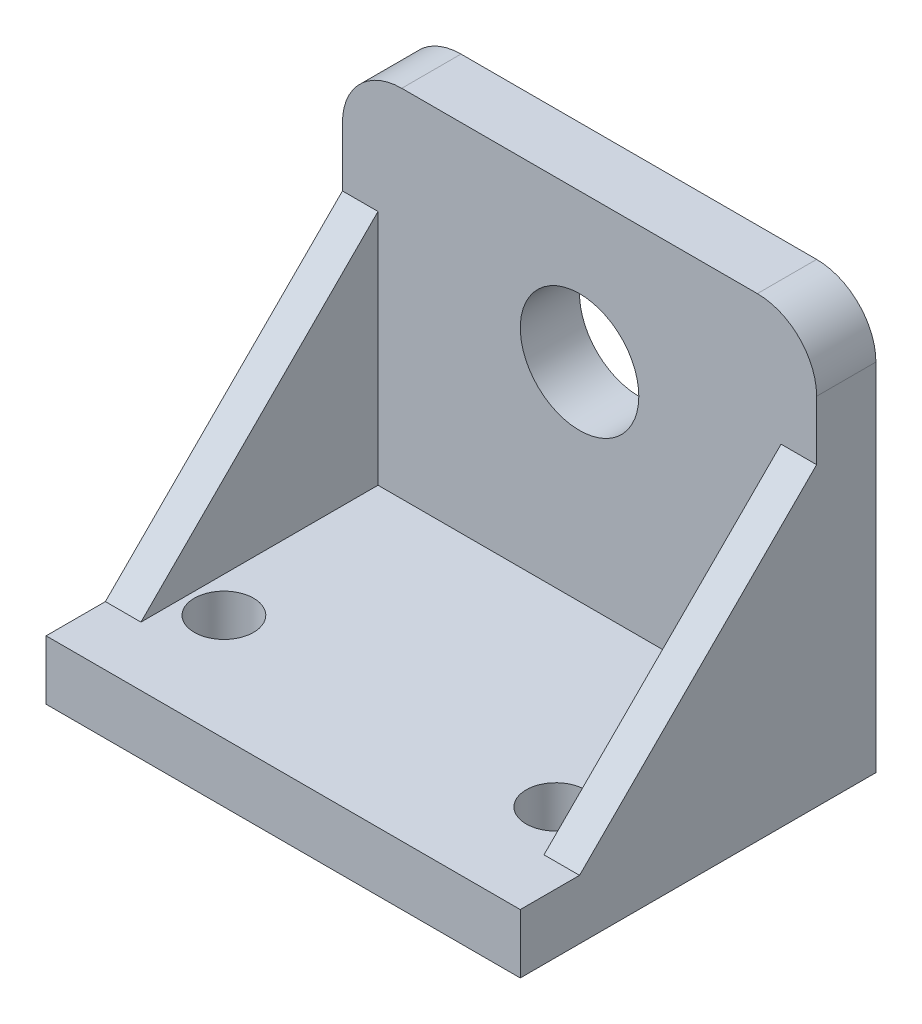
ISO-10303-21;
HEADER;
FILE_DESCRIPTION(('STEP AP214'),'2;1');
FILE_NAME('part.step','',(''),(''),'','','');
FILE_SCHEMA(('AUTOMOTIVE_DESIGN { 1 0 10303 214 1 1 1 1 }'));
ENDSEC;
DATA;
#1=APPLICATION_CONTEXT('core data for automotive mechanical design processes');
#2=APPLICATION_PROTOCOL_DEFINITION('international standard','automotive_design',2000,#1);
#3=PRODUCT_CONTEXT('',#1,'mechanical');
#4=PRODUCT('Part','Part','',(#3));
#5=PRODUCT_RELATED_PRODUCT_CATEGORY('part','',(#4));
#6=PRODUCT_DEFINITION_FORMATION('','',#4);
#7=PRODUCT_DEFINITION_CONTEXT('part definition',#1,'design');
#8=PRODUCT_DEFINITION('design','',#6,#7);
#9=PRODUCT_DEFINITION_SHAPE('','',#8);
#10=(LENGTH_UNIT() NAMED_UNIT(*) SI_UNIT(.MILLI.,.METRE.));
#11=(NAMED_UNIT(*) PLANE_ANGLE_UNIT() SI_UNIT($,.RADIAN.));
#12=(NAMED_UNIT(*) SI_UNIT($,.STERADIAN.) SOLID_ANGLE_UNIT());
#13=UNCERTAINTY_MEASURE_WITH_UNIT(LENGTH_MEASURE(1.E-05),#10,'distance_accuracy_value','');
#14=(GEOMETRIC_REPRESENTATION_CONTEXT(3) GLOBAL_UNCERTAINTY_ASSIGNED_CONTEXT((#13)) GLOBAL_UNIT_ASSIGNED_CONTEXT((#10,
#11,#12)) REPRESENTATION_CONTEXT('',''));
#15=CARTESIAN_POINT('',(0.,0.,0.));
#16=DIRECTION('',(0.,0.,1.));
#17=DIRECTION('',(1.,0.,0.));
#18=AXIS2_PLACEMENT_3D('',#15,#16,#17);
#19=CARTESIAN_POINT('',(0.,10.,0.));
#20=DIRECTION('',(0.,-1.,0.));
#21=DIRECTION('',(0.,0.,-1.));
#22=AXIS2_PLACEMENT_3D('',#19,#20,#21);
#23=PLANE('',#22);
#24=CARTESIAN_POINT('',(-28.,10.,42.));
#25=DIRECTION('',(0.,-1.,0.));
#26=DIRECTION('',(0.,0.,-1.));
#27=AXIS2_PLACEMENT_3D('',#24,#25,#26);
#28=CIRCLE('',#27,5.);
#29=CARTESIAN_POINT('',(-28.,10.,37.));
#30=VERTEX_POINT('',#29);
#31=EDGE_CURVE('E308',#30,#30,#28,.F.);
#32=ORIENTED_EDGE('',*,*,#31,.F.);
#33=EDGE_LOOP('',(#32));
#34=FACE_BOUND('',#33,.T.);
#35=CARTESIAN_POINT('',(28.,10.,42.));
#36=DIRECTION('',(0.,-1.,0.));
#37=DIRECTION('',(0.,0.,-1.));
#38=AXIS2_PLACEMENT_3D('',#35,#36,#37);
#39=CIRCLE('',#38,5.);
#40=CARTESIAN_POINT('',(28.,10.,37.));
#41=VERTEX_POINT('',#40);
#42=EDGE_CURVE('E312',#41,#41,#39,.F.);
#43=ORIENTED_EDGE('',*,*,#42,.F.);
#44=EDGE_LOOP('',(#43));
#45=FACE_BOUND('',#44,.T.);
#46=DIRECTION('',(-1.,0.,0.));
#47=VECTOR('',#46,1.);
#48=CARTESIAN_POINT('',(40.,10.,50.));
#49=LINE('',#48,#47);
#50=CARTESIAN_POINT('',(40.,10.,50.));
#51=VERTEX_POINT('',#50);
#52=CARTESIAN_POINT('',(34.,10.,50.));
#53=VERTEX_POINT('',#52);
#54=EDGE_CURVE('E68',#51,#53,#49,.T.);
#55=ORIENTED_EDGE('',*,*,#54,.T.);
#56=DIRECTION('',(0.,0.,-1.));
#57=VECTOR('',#56,1.);
#58=CARTESIAN_POINT('',(34.,10.,10.));
#59=LINE('',#58,#57);
#60=CARTESIAN_POINT('',(34.,10.,10.));
#61=VERTEX_POINT('',#60);
#62=EDGE_CURVE('E291',#53,#61,#59,.T.);
#63=ORIENTED_EDGE('',*,*,#62,.T.);
#64=DIRECTION('',(-1.,0.,0.));
#65=VECTOR('',#64,1.);
#66=CARTESIAN_POINT('',(0.,10.,10.));
#67=LINE('',#66,#65);
#68=CARTESIAN_POINT('',(-34.,10.,10.));
#69=VERTEX_POINT('',#68);
#70=EDGE_CURVE('E163',#61,#69,#67,.T.);
#71=ORIENTED_EDGE('',*,*,#70,.T.);
#72=DIRECTION('',(0.,0.,-1.));
#73=VECTOR('',#72,1.);
#74=CARTESIAN_POINT('',(-34.,10.,10.));
#75=LINE('',#74,#73);
#76=CARTESIAN_POINT('',(-34.,10.,50.));
#77=VERTEX_POINT('',#76);
#78=EDGE_CURVE('E278',#77,#69,#75,.T.);
#79=ORIENTED_EDGE('',*,*,#78,.F.);
#80=DIRECTION('',(-1.,0.,0.));
#81=VECTOR('',#80,1.);
#82=CARTESIAN_POINT('',(-34.,10.,50.));
#83=LINE('',#82,#81);
#84=CARTESIAN_POINT('',(-40.,10.,50.));
#85=VERTEX_POINT('',#84);
#86=EDGE_CURVE('E275',#77,#85,#83,.T.);
#87=ORIENTED_EDGE('',*,*,#86,.T.);
#88=DIRECTION('',(0.,0.,1.));
#89=VECTOR('',#88,1.);
#90=CARTESIAN_POINT('',(-40.,10.,60.));
#91=LINE('',#90,#89);
#92=CARTESIAN_POINT('',(-40.,10.,60.));
#93=VERTEX_POINT('',#92);
#94=EDGE_CURVE('E205',#85,#93,#91,.T.);
#95=ORIENTED_EDGE('',*,*,#94,.T.);
#96=DIRECTION('',(1.,0.,0.));
#97=VECTOR('',#96,1.);
#98=CARTESIAN_POINT('',(40.,10.,60.));
#99=LINE('',#98,#97);
#100=CARTESIAN_POINT('',(40.,10.,60.));
#101=VERTEX_POINT('',#100);
#102=EDGE_CURVE('E208',#93,#101,#99,.T.);
#103=ORIENTED_EDGE('',*,*,#102,.T.);
#104=DIRECTION('',(0.,0.,-1.));
#105=VECTOR('',#104,1.);
#106=CARTESIAN_POINT('',(40.,10.,0.));
#107=LINE('',#106,#105);
#108=EDGE_CURVE('E212',#101,#51,#107,.T.);
#109=ORIENTED_EDGE('',*,*,#108,.T.);
#110=EDGE_LOOP('',(#55,#63,#71,#79,#87,#95,#103,#109));
#111=FACE_BOUND('',#110,.T.);
#112=ADVANCED_FACE('F51',(#34,#45,#111),#23,.F.);
#113=CARTESIAN_POINT('',(30.,60.,10.));
#114=DIRECTION('',(0.,0.,1.));
#115=DIRECTION('',(1.,0.,0.));
#116=AXIS2_PLACEMENT_3D('',#113,#114,#115);
#117=PLANE('',#116);
#118=CARTESIAN_POINT('',(0.,45.,10.));
#119=DIRECTION('',(0.,0.,1.));
#120=DIRECTION('',(1.,0.,0.));
#121=AXIS2_PLACEMENT_3D('',#118,#119,#120);
#122=CIRCLE('',#121,10.);
#123=CARTESIAN_POINT('',(10.,45.,10.));
#124=VERTEX_POINT('',#123);
#125=EDGE_CURVE('E299',#124,#124,#122,.F.);
#126=ORIENTED_EDGE('',*,*,#125,.T.);
#127=EDGE_LOOP('',(#126));
#128=FACE_BOUND('',#127,.T.);
#129=DIRECTION('',(0.,1.,0.));
#130=VECTOR('',#129,1.);
#131=CARTESIAN_POINT('',(34.,50.,10.));
#132=LINE('',#131,#130);
#133=CARTESIAN_POINT('',(34.,50.,10.));
#134=VERTEX_POINT('',#133);
#135=EDGE_CURVE('E76',#61,#134,#132,.T.);
#136=ORIENTED_EDGE('',*,*,#135,.T.);
#137=DIRECTION('',(-1.,0.,0.));
#138=VECTOR('',#137,1.);
#139=CARTESIAN_POINT('',(40.,50.,10.));
#140=LINE('',#139,#138);
#141=CARTESIAN_POINT('',(40.,50.,10.));
#142=VERTEX_POINT('',#141);
#143=EDGE_CURVE('E148',#142,#134,#140,.T.);
#144=ORIENTED_EDGE('',*,*,#143,.F.);
#145=DIRECTION('',(0.,1.,0.));
#146=VECTOR('',#145,1.);
#147=CARTESIAN_POINT('',(40.,0.,10.));
#148=LINE('',#147,#146);
#149=CARTESIAN_POINT('',(40.,60.,10.));
#150=VERTEX_POINT('',#149);
#151=EDGE_CURVE('E141',#142,#150,#148,.T.);
#152=ORIENTED_EDGE('',*,*,#151,.T.);
#153=CARTESIAN_POINT('',(30.,60.,10.));
#154=DIRECTION('',(0.,0.,1.));
#155=DIRECTION('',(1.,0.,0.));
#156=AXIS2_PLACEMENT_3D('',#153,#154,#155);
#157=CIRCLE('',#156,10.);
#158=CARTESIAN_POINT('',(30.,70.,10.));
#159=VERTEX_POINT('',#158);
#160=EDGE_CURVE('E145',#150,#159,#157,.T.);
#161=ORIENTED_EDGE('',*,*,#160,.T.);
#162=DIRECTION('',(-1.,0.,0.));
#163=VECTOR('',#162,1.);
#164=CARTESIAN_POINT('',(30.,70.,10.));
#165=LINE('',#164,#163);
#166=CARTESIAN_POINT('',(-30.,70.,10.));
#167=VERTEX_POINT('',#166);
#168=EDGE_CURVE('E170',#159,#167,#165,.T.);
#169=ORIENTED_EDGE('',*,*,#168,.T.);
#170=CARTESIAN_POINT('',(-30.,60.,10.));
#171=DIRECTION('',(0.,0.,1.));
#172=DIRECTION('',(1.,0.,0.));
#173=AXIS2_PLACEMENT_3D('',#170,#171,#172);
#174=CIRCLE('',#173,10.);
#175=CARTESIAN_POINT('',(-40.,60.,10.));
#176=VERTEX_POINT('',#175);
#177=EDGE_CURVE('E175',#167,#176,#174,.T.);
#178=ORIENTED_EDGE('',*,*,#177,.T.);
#179=DIRECTION('',(0.,-1.,0.));
#180=VECTOR('',#179,1.);
#181=CARTESIAN_POINT('',(-40.,60.,10.));
#182=LINE('',#181,#180);
#183=CARTESIAN_POINT('',(-40.,50.,10.));
#184=VERTEX_POINT('',#183);
#185=EDGE_CURVE('E153',#176,#184,#182,.T.);
#186=ORIENTED_EDGE('',*,*,#185,.T.);
#187=DIRECTION('',(-1.,0.,0.));
#188=VECTOR('',#187,1.);
#189=CARTESIAN_POINT('',(-34.,50.,10.));
#190=LINE('',#189,#188);
#191=CARTESIAN_POINT('',(-34.,50.,10.));
#192=VERTEX_POINT('',#191);
#193=EDGE_CURVE('E186',#192,#184,#190,.T.);
#194=ORIENTED_EDGE('',*,*,#193,.F.);
#195=DIRECTION('',(0.,1.,0.));
#196=VECTOR('',#195,1.);
#197=CARTESIAN_POINT('',(-34.,50.,10.));
#198=LINE('',#197,#196);
#199=EDGE_CURVE('E268',#69,#192,#198,.T.);
#200=ORIENTED_EDGE('',*,*,#199,.F.);
#201=ORIENTED_EDGE('',*,*,#70,.F.);
#202=EDGE_LOOP('',(#136,#144,#152,#161,#169,#178,#186,#194,#200,#201));
#203=FACE_BOUND('',#202,.T.);
#204=ADVANCED_FACE('F143',(#128,#203),#117,.T.);
#205=CARTESIAN_POINT('',(-40.,10.,60.));
#206=DIRECTION('',(1.,0.,0.));
#207=DIRECTION('',(0.,0.,-1.));
#208=AXIS2_PLACEMENT_3D('',#205,#206,#207);
#209=PLANE('',#208);
#210=ORIENTED_EDGE('',*,*,#94,.F.);
#211=DIRECTION('',(0.,-0.707106781186548,0.707106781186548));
#212=VECTOR('',#211,1.);
#213=CARTESIAN_POINT('',(-40.,10.,50.));
#214=LINE('',#213,#212);
#215=EDGE_CURVE('E264',#184,#85,#214,.T.);
#216=ORIENTED_EDGE('',*,*,#215,.F.);
#217=ORIENTED_EDGE('',*,*,#185,.F.);
#218=DIRECTION('',(0.,0.,-1.));
#219=VECTOR('',#218,1.);
#220=CARTESIAN_POINT('',(-40.,60.,10.));
#221=LINE('',#220,#219);
#222=CARTESIAN_POINT('',(-40.,60.,0.));
#223=VERTEX_POINT('',#222);
#224=EDGE_CURVE('E181',#176,#223,#221,.T.);
#225=ORIENTED_EDGE('',*,*,#224,.T.);
#226=DIRECTION('',(0.,-1.,0.));
#227=VECTOR('',#226,1.);
#228=CARTESIAN_POINT('',(-40.,10.,0.));
#229=LINE('',#228,#227);
#230=CARTESIAN_POINT('',(-40.,0.,0.));
#231=VERTEX_POINT('',#230);
#232=EDGE_CURVE('E215',#223,#231,#229,.T.);
#233=ORIENTED_EDGE('',*,*,#232,.T.);
#234=DIRECTION('',(0.,0.,1.));
#235=VECTOR('',#234,1.);
#236=CARTESIAN_POINT('',(-40.,0.,60.));
#237=LINE('',#236,#235);
#238=CARTESIAN_POINT('',(-40.,0.,60.));
#239=VERTEX_POINT('',#238);
#240=EDGE_CURVE('E204',#231,#239,#237,.T.);
#241=ORIENTED_EDGE('',*,*,#240,.T.);
#242=DIRECTION('',(0.,-1.,0.));
#243=VECTOR('',#242,1.);
#244=CARTESIAN_POINT('',(-40.,10.,60.));
#245=LINE('',#244,#243);
#246=EDGE_CURVE('E11',#93,#239,#245,.T.);
#247=ORIENTED_EDGE('',*,*,#246,.F.);
#248=EDGE_LOOP('',(#210,#216,#217,#225,#233,#241,#247));
#249=FACE_BOUND('',#248,.T.);
#250=ADVANCED_FACE('F54',(#249),#209,.F.);
#251=CARTESIAN_POINT('',(40.,10.,60.));
#252=DIRECTION('',(0.,0.,-1.));
#253=DIRECTION('',(-1.,0.,0.));
#254=AXIS2_PLACEMENT_3D('',#251,#252,#253);
#255=PLANE('',#254);
#256=DIRECTION('',(1.,0.,0.));
#257=VECTOR('',#256,1.);
#258=CARTESIAN_POINT('',(40.,0.,60.));
#259=LINE('',#258,#257);
#260=CARTESIAN_POINT('',(40.,0.,60.));
#261=VERTEX_POINT('',#260);
#262=EDGE_CURVE('E218',#239,#261,#259,.T.);
#263=ORIENTED_EDGE('',*,*,#262,.T.);
#264=DIRECTION('',(0.,-1.,0.));
#265=VECTOR('',#264,1.);
#266=CARTESIAN_POINT('',(40.,10.,60.));
#267=LINE('',#266,#265);
#268=EDGE_CURVE('E61',#101,#261,#267,.T.);
#269=ORIENTED_EDGE('',*,*,#268,.F.);
#270=ORIENTED_EDGE('',*,*,#102,.F.);
#271=ORIENTED_EDGE('',*,*,#246,.T.);
#272=EDGE_LOOP('',(#263,#269,#270,#271));
#273=FACE_BOUND('',#272,.T.);
#274=ADVANCED_FACE('F394',(#273),#255,.F.);
#275=CARTESIAN_POINT('',(40.,10.,0.));
#276=DIRECTION('',(-1.,0.,0.));
#277=DIRECTION('',(0.,0.,1.));
#278=AXIS2_PLACEMENT_3D('',#275,#276,#277);
#279=PLANE('',#278);
#280=ORIENTED_EDGE('',*,*,#151,.F.);
#281=DIRECTION('',(0.,-0.707106781186548,0.707106781186548));
#282=VECTOR('',#281,1.);
#283=CARTESIAN_POINT('',(40.,10.,50.));
#284=LINE('',#283,#282);
#285=EDGE_CURVE('E290',#142,#51,#284,.T.);
#286=ORIENTED_EDGE('',*,*,#285,.T.);
#287=ORIENTED_EDGE('',*,*,#108,.F.);
#288=ORIENTED_EDGE('',*,*,#268,.T.);
#289=DIRECTION('',(0.,0.,-1.));
#290=VECTOR('',#289,1.);
#291=CARTESIAN_POINT('',(40.,0.,0.));
#292=LINE('',#291,#290);
#293=CARTESIAN_POINT('',(40.,0.,0.));
#294=VERTEX_POINT('',#293);
#295=EDGE_CURVE('E221',#261,#294,#292,.T.);
#296=ORIENTED_EDGE('',*,*,#295,.T.);
#297=DIRECTION('',(0.,-1.,0.));
#298=VECTOR('',#297,1.);
#299=CARTESIAN_POINT('',(40.,10.,0.));
#300=LINE('',#299,#298);
#301=CARTESIAN_POINT('',(40.,60.,0.));
#302=VERTEX_POINT('',#301);
#303=EDGE_CURVE('E159',#302,#294,#300,.T.);
#304=ORIENTED_EDGE('',*,*,#303,.F.);
#305=DIRECTION('',(0.,0.,-1.));
#306=VECTOR('',#305,1.);
#307=CARTESIAN_POINT('',(40.,60.,10.));
#308=LINE('',#307,#306);
#309=EDGE_CURVE('E156',#150,#302,#308,.T.);
#310=ORIENTED_EDGE('',*,*,#309,.F.);
#311=EDGE_LOOP('',(#280,#286,#287,#288,#296,#304,#310));
#312=FACE_BOUND('',#311,.T.);
#313=ADVANCED_FACE('F157',(#312),#279,.F.);
#314=CARTESIAN_POINT('',(-40.,10.,0.));
#315=DIRECTION('',(0.,0.,1.));
#316=DIRECTION('',(1.,0.,0.));
#317=AXIS2_PLACEMENT_3D('',#314,#315,#316);
#318=PLANE('',#317);
#319=CARTESIAN_POINT('',(0.,45.,0.));
#320=DIRECTION('',(0.,0.,1.));
#321=DIRECTION('',(1.,0.,0.));
#322=AXIS2_PLACEMENT_3D('',#319,#320,#321);
#323=CIRCLE('',#322,10.);
#324=CARTESIAN_POINT('',(10.,45.,0.));
#325=VERTEX_POINT('',#324);
#326=EDGE_CURVE('E304',#325,#325,#323,.T.);
#327=ORIENTED_EDGE('',*,*,#326,.T.);
#328=EDGE_LOOP('',(#327));
#329=FACE_BOUND('',#328,.T.);
#330=DIRECTION('',(-1.,0.,0.));
#331=VECTOR('',#330,1.);
#332=CARTESIAN_POINT('',(-40.,0.,0.));
#333=LINE('',#332,#331);
#334=EDGE_CURVE('E209',#294,#231,#333,.T.);
#335=ORIENTED_EDGE('',*,*,#334,.T.);
#336=ORIENTED_EDGE('',*,*,#232,.F.);
#337=CARTESIAN_POINT('',(-30.,60.,0.));
#338=DIRECTION('',(0.,0.,1.));
#339=DIRECTION('',(1.,0.,0.));
#340=AXIS2_PLACEMENT_3D('',#337,#338,#339);
#341=CIRCLE('',#340,10.);
#342=CARTESIAN_POINT('',(-30.,70.,0.));
#343=VERTEX_POINT('',#342);
#344=EDGE_CURVE('E189',#343,#223,#341,.T.);
#345=ORIENTED_EDGE('',*,*,#344,.F.);
#346=DIRECTION('',(-1.,0.,0.));
#347=VECTOR('',#346,1.);
#348=CARTESIAN_POINT('',(30.,70.,0.));
#349=LINE('',#348,#347);
#350=CARTESIAN_POINT('',(30.,70.,0.));
#351=VERTEX_POINT('',#350);
#352=EDGE_CURVE('E185',#351,#343,#349,.T.);
#353=ORIENTED_EDGE('',*,*,#352,.F.);
#354=CARTESIAN_POINT('',(30.,60.,0.));
#355=DIRECTION('',(0.,0.,1.));
#356=DIRECTION('',(1.,0.,0.));
#357=AXIS2_PLACEMENT_3D('',#354,#355,#356);
#358=CIRCLE('',#357,10.);
#359=EDGE_CURVE('E182',#302,#351,#358,.T.);
#360=ORIENTED_EDGE('',*,*,#359,.F.);
#361=ORIENTED_EDGE('',*,*,#303,.T.);
#362=EDGE_LOOP('',(#335,#336,#345,#353,#360,#361));
#363=FACE_BOUND('',#362,.T.);
#364=ADVANCED_FACE('F244',(#329,#363),#318,.F.);
#365=CARTESIAN_POINT('',(0.,0.,0.));
#366=DIRECTION('',(0.,-1.,0.));
#367=DIRECTION('',(0.,0.,-1.));
#368=AXIS2_PLACEMENT_3D('',#365,#366,#367);
#369=PLANE('',#368);
#370=CARTESIAN_POINT('',(-28.,0.,42.));
#371=DIRECTION('',(0.,1.,0.));
#372=DIRECTION('',(0.,0.,1.));
#373=AXIS2_PLACEMENT_3D('',#370,#371,#372);
#374=CIRCLE('',#373,5.);
#375=CARTESIAN_POINT('',(-28.,0.,47.));
#376=VERTEX_POINT('',#375);
#377=EDGE_CURVE('E316',#376,#376,#374,.T.);
#378=ORIENTED_EDGE('',*,*,#377,.T.);
#379=EDGE_LOOP('',(#378));
#380=FACE_BOUND('',#379,.T.);
#381=CARTESIAN_POINT('',(28.,0.,42.));
#382=DIRECTION('',(0.,1.,0.));
#383=DIRECTION('',(0.,0.,1.));
#384=AXIS2_PLACEMENT_3D('',#381,#382,#383);
#385=CIRCLE('',#384,5.);
#386=CARTESIAN_POINT('',(28.,0.,47.));
#387=VERTEX_POINT('',#386);
#388=EDGE_CURVE('E317',#387,#387,#385,.T.);
#389=ORIENTED_EDGE('',*,*,#388,.T.);
#390=EDGE_LOOP('',(#389));
#391=FACE_BOUND('',#390,.T.);
#392=ORIENTED_EDGE('',*,*,#262,.F.);
#393=ORIENTED_EDGE('',*,*,#240,.F.);
#394=ORIENTED_EDGE('',*,*,#334,.F.);
#395=ORIENTED_EDGE('',*,*,#295,.F.);
#396=EDGE_LOOP('',(#392,#393,#394,#395));
#397=FACE_BOUND('',#396,.T.);
#398=ADVANCED_FACE('F241',(#380,#391,#397),#369,.T.);
#399=CARTESIAN_POINT('',(30.,60.,10.));
#400=DIRECTION('',(0.,0.,-1.));
#401=DIRECTION('',(-1.,0.,0.));
#402=AXIS2_PLACEMENT_3D('',#399,#400,#401);
#403=CYLINDRICAL_SURFACE('',#402,10.);
#404=ORIENTED_EDGE('',*,*,#359,.T.);
#405=DIRECTION('',(0.,0.,-1.));
#406=VECTOR('',#405,1.);
#407=CARTESIAN_POINT('',(30.,70.,10.));
#408=LINE('',#407,#406);
#409=EDGE_CURVE('E164',#159,#351,#408,.T.);
#410=ORIENTED_EDGE('',*,*,#409,.F.);
#411=ORIENTED_EDGE('',*,*,#160,.F.);
#412=ORIENTED_EDGE('',*,*,#309,.T.);
#413=EDGE_LOOP('',(#404,#410,#411,#412));
#414=FACE_BOUND('',#413,.T.);
#415=ADVANCED_FACE('F166',(#414),#403,.T.);
#416=CARTESIAN_POINT('',(30.,70.,10.));
#417=DIRECTION('',(0.,-1.,0.));
#418=DIRECTION('',(0.,0.,-1.));
#419=AXIS2_PLACEMENT_3D('',#416,#417,#418);
#420=PLANE('',#419);
#421=ORIENTED_EDGE('',*,*,#352,.T.);
#422=DIRECTION('',(0.,0.,-1.));
#423=VECTOR('',#422,1.);
#424=CARTESIAN_POINT('',(-30.,70.,10.));
#425=LINE('',#424,#423);
#426=EDGE_CURVE('E196',#167,#343,#425,.T.);
#427=ORIENTED_EDGE('',*,*,#426,.F.);
#428=ORIENTED_EDGE('',*,*,#168,.F.);
#429=ORIENTED_EDGE('',*,*,#409,.T.);
#430=EDGE_LOOP('',(#421,#427,#428,#429));
#431=FACE_BOUND('',#430,.T.);
#432=ADVANCED_FACE('F258',(#431),#420,.F.);
#433=CARTESIAN_POINT('',(-30.,60.,10.));
#434=DIRECTION('',(0.,0.,-1.));
#435=DIRECTION('',(-1.,0.,0.));
#436=AXIS2_PLACEMENT_3D('',#433,#434,#435);
#437=CYLINDRICAL_SURFACE('',#436,10.);
#438=ORIENTED_EDGE('',*,*,#344,.T.);
#439=ORIENTED_EDGE('',*,*,#224,.F.);
#440=ORIENTED_EDGE('',*,*,#177,.F.);
#441=ORIENTED_EDGE('',*,*,#426,.T.);
#442=EDGE_LOOP('',(#438,#439,#440,#441));
#443=FACE_BOUND('',#442,.T.);
#444=ADVANCED_FACE('F254',(#443),#437,.T.);
#445=CARTESIAN_POINT('',(-34.,10.,50.));
#446=DIRECTION('',(0.,-0.707106781186547,-0.707106781186547));
#447=DIRECTION('',(0.,0.707106781186548,-0.707106781186548));
#448=AXIS2_PLACEMENT_3D('',#445,#446,#447);
#449=PLANE('',#448);
#450=ORIENTED_EDGE('',*,*,#215,.T.);
#451=ORIENTED_EDGE('',*,*,#86,.F.);
#452=DIRECTION('',(0.,-0.707106781186548,0.707106781186548));
#453=VECTOR('',#452,1.);
#454=CARTESIAN_POINT('',(-34.,10.,50.));
#455=LINE('',#454,#453);
#456=EDGE_CURVE('E272',#192,#77,#455,.T.);
#457=ORIENTED_EDGE('',*,*,#456,.F.);
#458=ORIENTED_EDGE('',*,*,#193,.T.);
#459=EDGE_LOOP('',(#450,#451,#457,#458));
#460=FACE_BOUND('',#459,.T.);
#461=ADVANCED_FACE('F270',(#460),#449,.F.);
#462=CARTESIAN_POINT('',(-34.,0.,0.));
#463=DIRECTION('',(-1.,0.,0.));
#464=DIRECTION('',(0.,0.,1.));
#465=AXIS2_PLACEMENT_3D('',#462,#463,#464);
#466=PLANE('',#465);
#467=ORIENTED_EDGE('',*,*,#199,.T.);
#468=ORIENTED_EDGE('',*,*,#456,.T.);
#469=ORIENTED_EDGE('',*,*,#78,.T.);
#470=EDGE_LOOP('',(#467,#468,#469));
#471=FACE_BOUND('',#470,.T.);
#472=ADVANCED_FACE('F362',(#471),#466,.F.);
#473=CARTESIAN_POINT('',(40.,10.,50.));
#474=DIRECTION('',(0.,-0.707106781186547,-0.707106781186547));
#475=DIRECTION('',(0.,0.707106781186548,-0.707106781186548));
#476=AXIS2_PLACEMENT_3D('',#473,#474,#475);
#477=PLANE('',#476);
#478=DIRECTION('',(0.,-0.707106781186548,0.707106781186548));
#479=VECTOR('',#478,1.);
#480=CARTESIAN_POINT('',(34.,10.,50.));
#481=LINE('',#480,#479);
#482=EDGE_CURVE('E294',#134,#53,#481,.T.);
#483=ORIENTED_EDGE('',*,*,#482,.T.);
#484=ORIENTED_EDGE('',*,*,#54,.F.);
#485=ORIENTED_EDGE('',*,*,#285,.F.);
#486=ORIENTED_EDGE('',*,*,#143,.T.);
#487=EDGE_LOOP('',(#483,#484,#485,#486));
#488=FACE_BOUND('',#487,.T.);
#489=ADVANCED_FACE('F357',(#488),#477,.F.);
#490=CARTESIAN_POINT('',(34.,0.,0.));
#491=DIRECTION('',(-1.,0.,0.));
#492=DIRECTION('',(0.,0.,1.));
#493=AXIS2_PLACEMENT_3D('',#490,#491,#492);
#494=PLANE('',#493);
#495=ORIENTED_EDGE('',*,*,#135,.F.);
#496=ORIENTED_EDGE('',*,*,#62,.F.);
#497=ORIENTED_EDGE('',*,*,#482,.F.);
#498=EDGE_LOOP('',(#495,#496,#497));
#499=FACE_BOUND('',#498,.T.);
#500=ADVANCED_FACE('F345',(#499),#494,.T.);
#501=CARTESIAN_POINT('',(0.,45.,60.));
#502=DIRECTION('',(0.,0.,-1.));
#503=DIRECTION('',(-1.,0.,0.));
#504=AXIS2_PLACEMENT_3D('',#501,#502,#503);
#505=CYLINDRICAL_SURFACE('',#504,10.);
#506=ORIENTED_EDGE('',*,*,#125,.F.);
#507=EDGE_LOOP('',(#506));
#508=FACE_BOUND('',#507,.T.);
#509=ORIENTED_EDGE('',*,*,#326,.F.);
#510=EDGE_LOOP('',(#509));
#511=FACE_BOUND('',#510,.T.);
#512=ADVANCED_FACE('F340',(#508,#511),#505,.F.);
#513=CARTESIAN_POINT('',(28.,70.,42.));
#514=DIRECTION('',(0.,-1.,0.));
#515=DIRECTION('',(0.,0.,-1.));
#516=AXIS2_PLACEMENT_3D('',#513,#514,#515);
#517=CYLINDRICAL_SURFACE('',#516,5.);
#518=ORIENTED_EDGE('',*,*,#388,.F.);
#519=EDGE_LOOP('',(#518));
#520=FACE_BOUND('',#519,.T.);
#521=ORIENTED_EDGE('',*,*,#42,.T.);
#522=EDGE_LOOP('',(#521));
#523=FACE_BOUND('',#522,.T.);
#524=ADVANCED_FACE('F330',(#520,#523),#517,.F.);
#525=CARTESIAN_POINT('',(-28.,70.,42.));
#526=DIRECTION('',(0.,-1.,0.));
#527=DIRECTION('',(0.,0.,-1.));
#528=AXIS2_PLACEMENT_3D('',#525,#526,#527);
#529=CYLINDRICAL_SURFACE('',#528,5.);
#530=ORIENTED_EDGE('',*,*,#377,.F.);
#531=EDGE_LOOP('',(#530));
#532=FACE_BOUND('',#531,.T.);
#533=ORIENTED_EDGE('',*,*,#31,.T.);
#534=EDGE_LOOP('',(#533));
#535=FACE_BOUND('',#534,.T.);
#536=ADVANCED_FACE('F327',(#532,#535),#529,.F.);
#537=CLOSED_SHELL('',(#112,#204,#250,#274,#313,#364,#398,#415,#432,#444,#461,#472,#489,#500,
#512,#524,#536));
#538=MANIFOLD_SOLID_BREP('B2',#537);
#539=ADVANCED_BREP_SHAPE_REPRESENTATION('',(#18,#538),#14);
#540=SHAPE_DEFINITION_REPRESENTATION(#9,#539);
ENDSEC;
END-ISO-10303-21;
